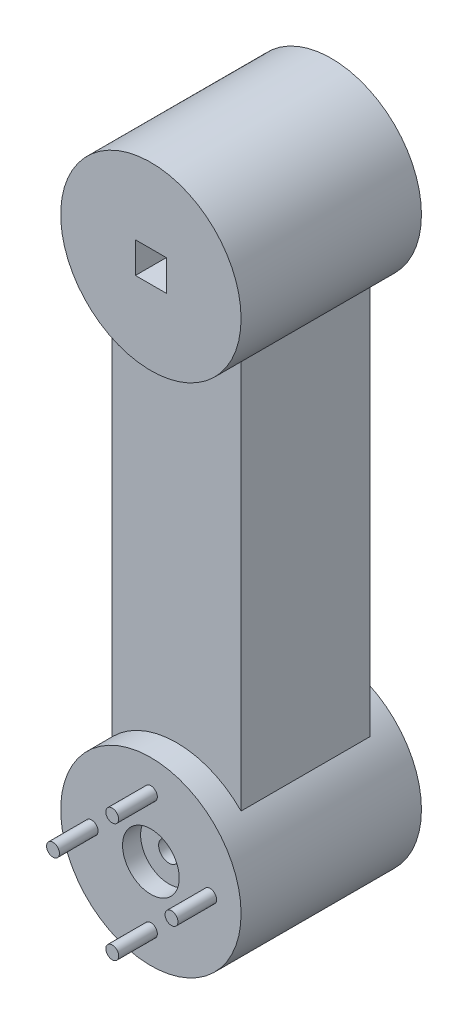
ISO-10303-21;
HEADER;
FILE_DESCRIPTION(('STEP AP214'),'2;1');
FILE_NAME('part.step','',(''),(''),'','','');
FILE_SCHEMA(('AUTOMOTIVE_DESIGN { 1 0 10303 214 1 1 1 1 }'));
ENDSEC;
DATA;
#1=APPLICATION_CONTEXT('core data for automotive mechanical design processes');
#2=APPLICATION_PROTOCOL_DEFINITION('international standard','automotive_design',2000,#1);
#3=PRODUCT_CONTEXT('',#1,'mechanical');
#4=PRODUCT('Part','Part','',(#3));
#5=PRODUCT_RELATED_PRODUCT_CATEGORY('part','',(#4));
#6=PRODUCT_DEFINITION_FORMATION('','',#4);
#7=PRODUCT_DEFINITION_CONTEXT('part definition',#1,'design');
#8=PRODUCT_DEFINITION('design','',#6,#7);
#9=PRODUCT_DEFINITION_SHAPE('','',#8);
#10=(LENGTH_UNIT() NAMED_UNIT(*) SI_UNIT(.MILLI.,.METRE.));
#11=(NAMED_UNIT(*) PLANE_ANGLE_UNIT() SI_UNIT($,.RADIAN.));
#12=(NAMED_UNIT(*) SI_UNIT($,.STERADIAN.) SOLID_ANGLE_UNIT());
#13=UNCERTAINTY_MEASURE_WITH_UNIT(LENGTH_MEASURE(1.E-05),#10,'distance_accuracy_value','');
#14=(GEOMETRIC_REPRESENTATION_CONTEXT(3) GLOBAL_UNCERTAINTY_ASSIGNED_CONTEXT((#13)) GLOBAL_UNIT_ASSIGNED_CONTEXT((#10,
#11,#12)) REPRESENTATION_CONTEXT('',''));
#15=CARTESIAN_POINT('',(0.,0.,0.));
#16=DIRECTION('',(0.,0.,1.));
#17=DIRECTION('',(1.,0.,0.));
#18=AXIS2_PLACEMENT_3D('',#15,#16,#17);
#19=CARTESIAN_POINT('',(0.,0.,150.));
#20=DIRECTION('',(0.,0.,-1.));
#21=DIRECTION('',(-1.,0.,0.));
#22=AXIS2_PLACEMENT_3D('',#19,#20,#21);
#23=CYLINDRICAL_SURFACE('',#22,4.);
#24=CARTESIAN_POINT('',(0.,0.,7.00000000000001));
#25=DIRECTION('',(0.,0.,1.));
#26=DIRECTION('',(1.,0.,0.));
#27=AXIS2_PLACEMENT_3D('',#24,#25,#26);
#28=CIRCLE('',#27,4.);
#29=CARTESIAN_POINT('',(4.,0.,7.00000000000001));
#30=VERTEX_POINT('',#29);
#31=EDGE_CURVE('E191',#30,#30,#28,.T.);
#32=ORIENTED_EDGE('',*,*,#31,.F.);
#33=EDGE_LOOP('',(#32));
#34=FACE_BOUND('',#33,.T.);
#35=CARTESIAN_POINT('',(0.,0.,63.));
#36=DIRECTION('',(0.,0.,1.));
#37=DIRECTION('',(1.,0.,0.));
#38=AXIS2_PLACEMENT_3D('',#35,#36,#37);
#39=CIRCLE('',#38,4.);
#40=CARTESIAN_POINT('',(4.,0.,63.));
#41=VERTEX_POINT('',#40);
#42=EDGE_CURVE('E183',#41,#41,#39,.T.);
#43=ORIENTED_EDGE('',*,*,#42,.T.);
#44=EDGE_LOOP('',(#43));
#45=FACE_BOUND('',#44,.T.);
#46=ADVANCED_FACE('F45',(#34,#45),#23,.F.);
#47=CARTESIAN_POINT('',(25.,200.,60.));
#48=DIRECTION('',(-1.,0.,0.));
#49=DIRECTION('',(0.,0.,1.));
#50=AXIS2_PLACEMENT_3D('',#47,#48,#49);
#51=PLANE('',#50);
#52=DIRECTION('',(0.,0.,-1.));
#53=VECTOR('',#52,1.);
#54=CARTESIAN_POINT('',(25.,175.505102572168,70.));
#55=LINE('',#54,#53);
#56=CARTESIAN_POINT('',(25.,175.505102572168,60.));
#57=VERTEX_POINT('',#56);
#58=CARTESIAN_POINT('',(25.,175.505102572168,10.));
#59=VERTEX_POINT('',#58);
#60=EDGE_CURVE('E208',#57,#59,#55,.T.);
#61=ORIENTED_EDGE('',*,*,#60,.F.);
#62=DIRECTION('',(0.,-1.,0.));
#63=VECTOR('',#62,1.);
#64=CARTESIAN_POINT('',(25.,200.,60.));
#65=LINE('',#64,#63);
#66=CARTESIAN_POINT('',(25.,24.494897427832,60.));
#67=VERTEX_POINT('',#66);
#68=EDGE_CURVE('E216',#57,#67,#65,.T.);
#69=ORIENTED_EDGE('',*,*,#68,.T.);
#70=DIRECTION('',(0.,0.,-1.));
#71=VECTOR('',#70,1.);
#72=CARTESIAN_POINT('',(25.,24.494897427832,70.));
#73=LINE('',#72,#71);
#74=CARTESIAN_POINT('',(25.,24.494897427832,10.));
#75=VERTEX_POINT('',#74);
#76=EDGE_CURVE('E248',#67,#75,#73,.T.);
#77=ORIENTED_EDGE('',*,*,#76,.T.);
#78=DIRECTION('',(0.,-1.,0.));
#79=VECTOR('',#78,1.);
#80=CARTESIAN_POINT('',(25.,200.,10.));
#81=LINE('',#80,#79);
#82=EDGE_CURVE('E225',#59,#75,#81,.T.);
#83=ORIENTED_EDGE('',*,*,#82,.F.);
#84=EDGE_LOOP('',(#61,#69,#77,#83));
#85=FACE_BOUND('',#84,.T.);
#86=ADVANCED_FACE('F290',(#85),#51,.F.);
#87=CARTESIAN_POINT('',(-25.,200.,60.));
#88=DIRECTION('',(1.,0.,0.));
#89=DIRECTION('',(0.,0.,-1.));
#90=AXIS2_PLACEMENT_3D('',#87,#88,#89);
#91=PLANE('',#90);
#92=DIRECTION('',(0.,0.,-1.));
#93=VECTOR('',#92,1.);
#94=CARTESIAN_POINT('',(-25.,175.505102572168,70.));
#95=LINE('',#94,#93);
#96=CARTESIAN_POINT('',(-25.,175.505102572168,10.));
#97=VERTEX_POINT('',#96);
#98=CARTESIAN_POINT('',(-25.,175.505102572168,60.));
#99=VERTEX_POINT('',#98);
#100=EDGE_CURVE('E200',#97,#99,#95,.F.);
#101=ORIENTED_EDGE('',*,*,#100,.F.);
#102=DIRECTION('',(0.,-1.,0.));
#103=VECTOR('',#102,1.);
#104=CARTESIAN_POINT('',(-25.,200.,10.));
#105=LINE('',#104,#103);
#106=CARTESIAN_POINT('',(-25.,24.494897427832,10.));
#107=VERTEX_POINT('',#106);
#108=EDGE_CURVE('E222',#97,#107,#105,.T.);
#109=ORIENTED_EDGE('',*,*,#108,.T.);
#110=DIRECTION('',(0.,0.,-1.));
#111=VECTOR('',#110,1.);
#112=CARTESIAN_POINT('',(-25.,24.494897427832,70.));
#113=LINE('',#112,#111);
#114=CARTESIAN_POINT('',(-25.,24.494897427832,60.));
#115=VERTEX_POINT('',#114);
#116=EDGE_CURVE('E240',#107,#115,#113,.F.);
#117=ORIENTED_EDGE('',*,*,#116,.T.);
#118=DIRECTION('',(0.,-1.,0.));
#119=VECTOR('',#118,1.);
#120=CARTESIAN_POINT('',(-25.,200.,60.));
#121=LINE('',#120,#119);
#122=EDGE_CURVE('E219',#99,#115,#121,.T.);
#123=ORIENTED_EDGE('',*,*,#122,.F.);
#124=EDGE_LOOP('',(#101,#109,#117,#123));
#125=FACE_BOUND('',#124,.T.);
#126=ADVANCED_FACE('F298',(#125),#91,.F.);
#127=CARTESIAN_POINT('',(0.,0.,70.));
#128=DIRECTION('',(0.,0.,-1.));
#129=DIRECTION('',(-1.,0.,0.));
#130=AXIS2_PLACEMENT_3D('',#127,#128,#129);
#131=CYLINDRICAL_SURFACE('',#130,35.0000000000001);
#132=CARTESIAN_POINT('',(0.,0.,0.));
#133=DIRECTION('',(0.,0.,1.));
#134=DIRECTION('',(1.,0.,0.));
#135=AXIS2_PLACEMENT_3D('',#132,#133,#134);
#136=CIRCLE('',#135,35.0000000000001);
#137=CARTESIAN_POINT('',(35.0000000000001,0.,0.));
#138=VERTEX_POINT('',#137);
#139=EDGE_CURVE('E228',#138,#138,#136,.T.);
#140=ORIENTED_EDGE('',*,*,#139,.T.);
#141=EDGE_LOOP('',(#140));
#142=FACE_BOUND('',#141,.T.);
#143=CARTESIAN_POINT('',(0.,0.,70.));
#144=DIRECTION('',(0.,0.,1.));
#145=DIRECTION('',(1.,0.,0.));
#146=AXIS2_PLACEMENT_3D('',#143,#144,#145);
#147=CIRCLE('',#146,35.0000000000001);
#148=CARTESIAN_POINT('',(35.0000000000001,0.,70.));
#149=VERTEX_POINT('',#148);
#150=EDGE_CURVE('E229',#149,#149,#147,.T.);
#151=ORIENTED_EDGE('',*,*,#150,.F.);
#152=EDGE_LOOP('',(#151));
#153=FACE_BOUND('',#152,.T.);
#154=ORIENTED_EDGE('',*,*,#76,.F.);
#155=CARTESIAN_POINT('',(0.,0.,60.));
#156=DIRECTION('',(0.,0.,-1.));
#157=DIRECTION('',(-1.,0.,0.));
#158=AXIS2_PLACEMENT_3D('',#155,#156,#157);
#159=CIRCLE('',#158,35.0000000000001);
#160=EDGE_CURVE('E233',#115,#67,#159,.T.);
#161=ORIENTED_EDGE('',*,*,#160,.F.);
#162=ORIENTED_EDGE('',*,*,#116,.F.);
#163=CARTESIAN_POINT('',(0.,0.,10.));
#164=DIRECTION('',(0.,0.,1.));
#165=DIRECTION('',(1.,0.,0.));
#166=AXIS2_PLACEMENT_3D('',#163,#164,#165);
#167=CIRCLE('',#166,35.0000000000001);
#168=EDGE_CURVE('E244',#75,#107,#167,.T.);
#169=ORIENTED_EDGE('',*,*,#168,.F.);
#170=EDGE_LOOP('',(#154,#161,#162,#169));
#171=FACE_BOUND('',#170,.T.);
#172=ADVANCED_FACE('F47',(#142,#153,#171),#131,.T.);
#173=CARTESIAN_POINT('',(0.,0.,70.));
#174=DIRECTION('',(0.,0.,1.));
#175=DIRECTION('',(1.,0.,0.));
#176=AXIS2_PLACEMENT_3D('',#173,#174,#175);
#177=PLANE('',#176);
#178=CARTESIAN_POINT('',(0.,23.0000000000001,70.));
#179=DIRECTION('',(0.,0.,1.));
#180=DIRECTION('',(1.,0.,0.));
#181=AXIS2_PLACEMENT_3D('',#178,#179,#180);
#182=CIRCLE('',#181,2.5);
#183=CARTESIAN_POINT('',(2.5,23.0000000000001,70.));
#184=VERTEX_POINT('',#183);
#185=EDGE_CURVE('E147',#184,#184,#182,.T.);
#186=ORIENTED_EDGE('',*,*,#185,.F.);
#187=EDGE_LOOP('',(#186));
#188=FACE_BOUND('',#187,.T.);
#189=CARTESIAN_POINT('',(23.0000000000001,0.,70.));
#190=DIRECTION('',(0.,0.,1.));
#191=DIRECTION('',(1.,0.,0.));
#192=AXIS2_PLACEMENT_3D('',#189,#190,#191);
#193=CIRCLE('',#192,2.5);
#194=CARTESIAN_POINT('',(25.5000000000001,0.,70.));
#195=VERTEX_POINT('',#194);
#196=EDGE_CURVE('E155',#195,#195,#193,.T.);
#197=ORIENTED_EDGE('',*,*,#196,.F.);
#198=EDGE_LOOP('',(#197));
#199=FACE_BOUND('',#198,.T.);
#200=CARTESIAN_POINT('',(0.,-23.0000000000001,70.));
#201=DIRECTION('',(0.,0.,1.));
#202=DIRECTION('',(1.,0.,0.));
#203=AXIS2_PLACEMENT_3D('',#200,#201,#202);
#204=CIRCLE('',#203,2.5);
#205=CARTESIAN_POINT('',(2.5,-23.0000000000001,70.));
#206=VERTEX_POINT('',#205);
#207=EDGE_CURVE('E163',#206,#206,#204,.T.);
#208=ORIENTED_EDGE('',*,*,#207,.F.);
#209=EDGE_LOOP('',(#208));
#210=FACE_BOUND('',#209,.T.);
#211=CARTESIAN_POINT('',(-23.0000000000001,0.,70.));
#212=DIRECTION('',(0.,0.,1.));
#213=DIRECTION('',(1.,0.,0.));
#214=AXIS2_PLACEMENT_3D('',#211,#212,#213);
#215=CIRCLE('',#214,2.5);
#216=CARTESIAN_POINT('',(-20.5000000000001,0.,70.));
#217=VERTEX_POINT('',#216);
#218=EDGE_CURVE('E167',#217,#217,#215,.T.);
#219=ORIENTED_EDGE('',*,*,#218,.F.);
#220=EDGE_LOOP('',(#219));
#221=FACE_BOUND('',#220,.T.);
#222=CARTESIAN_POINT('',(0.,0.,70.));
#223=DIRECTION('',(0.,0.,1.));
#224=DIRECTION('',(1.,0.,0.));
#225=AXIS2_PLACEMENT_3D('',#222,#223,#224);
#226=CIRCLE('',#225,11.);
#227=CARTESIAN_POINT('',(11.,0.,70.));
#228=VERTEX_POINT('',#227);
#229=EDGE_CURVE('E175',#228,#228,#226,.T.);
#230=ORIENTED_EDGE('',*,*,#229,.F.);
#231=EDGE_LOOP('',(#230));
#232=FACE_BOUND('',#231,.T.);
#233=ORIENTED_EDGE('',*,*,#150,.T.);
#234=EDGE_LOOP('',(#233));
#235=FACE_BOUND('',#234,.T.);
#236=ADVANCED_FACE('F326',(#188,#199,#210,#221,#232,#235),#177,.T.);
#237=CARTESIAN_POINT('',(0.,0.,0.));
#238=DIRECTION('',(0.,0.,1.));
#239=DIRECTION('',(1.,0.,0.));
#240=AXIS2_PLACEMENT_3D('',#237,#238,#239);
#241=PLANE('',#240);
#242=CARTESIAN_POINT('',(0.,0.,0.));
#243=DIRECTION('',(0.,0.,1.));
#244=DIRECTION('',(1.,0.,0.));
#245=AXIS2_PLACEMENT_3D('',#242,#243,#244);
#246=CIRCLE('',#245,11.);
#247=CARTESIAN_POINT('',(11.,0.,0.));
#248=VERTEX_POINT('',#247);
#249=EDGE_CURVE('E192',#248,#248,#246,.T.);
#250=ORIENTED_EDGE('',*,*,#249,.T.);
#251=EDGE_LOOP('',(#250));
#252=FACE_BOUND('',#251,.T.);
#253=ORIENTED_EDGE('',*,*,#139,.F.);
#254=EDGE_LOOP('',(#253));
#255=FACE_BOUND('',#254,.T.);
#256=ADVANCED_FACE('F323',(#252,#255),#241,.F.);
#257=CARTESIAN_POINT('',(-25.,200.,10.));
#258=DIRECTION('',(0.,0.,1.));
#259=DIRECTION('',(1.,0.,0.));
#260=AXIS2_PLACEMENT_3D('',#257,#258,#259);
#261=PLANE('',#260);
#262=CARTESIAN_POINT('',(0.,200.,10.));
#263=DIRECTION('',(0.,0.,1.));
#264=DIRECTION('',(1.,0.,0.));
#265=AXIS2_PLACEMENT_3D('',#262,#263,#264);
#266=CIRCLE('',#265,35.);
#267=EDGE_CURVE('E212',#59,#97,#266,.F.);
#268=ORIENTED_EDGE('',*,*,#267,.F.);
#269=ORIENTED_EDGE('',*,*,#82,.T.);
#270=ORIENTED_EDGE('',*,*,#168,.T.);
#271=ORIENTED_EDGE('',*,*,#108,.F.);
#272=EDGE_LOOP('',(#268,#269,#270,#271));
#273=FACE_BOUND('',#272,.T.);
#274=ADVANCED_FACE('F317',(#273),#261,.F.);
#275=CARTESIAN_POINT('',(-25.,200.,60.));
#276=DIRECTION('',(0.,0.,-1.));
#277=DIRECTION('',(-1.,0.,0.));
#278=AXIS2_PLACEMENT_3D('',#275,#276,#277);
#279=PLANE('',#278);
#280=CARTESIAN_POINT('',(0.,200.,60.));
#281=DIRECTION('',(0.,0.,-1.));
#282=DIRECTION('',(-1.,0.,0.));
#283=AXIS2_PLACEMENT_3D('',#280,#281,#282);
#284=CIRCLE('',#283,35.);
#285=EDGE_CURVE('E252',#99,#57,#284,.F.);
#286=ORIENTED_EDGE('',*,*,#285,.F.);
#287=ORIENTED_EDGE('',*,*,#122,.T.);
#288=ORIENTED_EDGE('',*,*,#160,.T.);
#289=ORIENTED_EDGE('',*,*,#68,.F.);
#290=EDGE_LOOP('',(#286,#287,#288,#289));
#291=FACE_BOUND('',#290,.T.);
#292=ADVANCED_FACE('F313',(#291),#279,.F.);
#293=CARTESIAN_POINT('',(0.,200.,70.));
#294=DIRECTION('',(0.,0.,-1.));
#295=DIRECTION('',(-1.,0.,0.));
#296=AXIS2_PLACEMENT_3D('',#293,#294,#295);
#297=CYLINDRICAL_SURFACE('',#296,35.);
#298=CARTESIAN_POINT('',(0.,200.,70.));
#299=DIRECTION('',(0.,0.,1.));
#300=DIRECTION('',(1.,0.,0.));
#301=AXIS2_PLACEMENT_3D('',#298,#299,#300);
#302=CIRCLE('',#301,35.);
#303=CARTESIAN_POINT('',(35.,200.,70.));
#304=VERTEX_POINT('',#303);
#305=EDGE_CURVE('E196',#304,#304,#302,.T.);
#306=ORIENTED_EDGE('',*,*,#305,.F.);
#307=EDGE_LOOP('',(#306));
#308=FACE_BOUND('',#307,.T.);
#309=CARTESIAN_POINT('',(0.,200.,0.));
#310=DIRECTION('',(0.,0.,1.));
#311=DIRECTION('',(1.,0.,0.));
#312=AXIS2_PLACEMENT_3D('',#309,#310,#311);
#313=CIRCLE('',#312,35.);
#314=CARTESIAN_POINT('',(35.,200.,0.));
#315=VERTEX_POINT('',#314);
#316=EDGE_CURVE('E201',#315,#315,#313,.T.);
#317=ORIENTED_EDGE('',*,*,#316,.T.);
#318=EDGE_LOOP('',(#317));
#319=FACE_BOUND('',#318,.T.);
#320=ORIENTED_EDGE('',*,*,#60,.T.);
#321=ORIENTED_EDGE('',*,*,#267,.T.);
#322=ORIENTED_EDGE('',*,*,#100,.T.);
#323=ORIENTED_EDGE('',*,*,#285,.T.);
#324=EDGE_LOOP('',(#320,#321,#322,#323));
#325=FACE_BOUND('',#324,.T.);
#326=ADVANCED_FACE('F309',(#308,#319,#325),#297,.T.);
#327=CARTESIAN_POINT('',(0.,200.,70.));
#328=DIRECTION('',(0.,0.,1.));
#329=DIRECTION('',(1.,0.,0.));
#330=AXIS2_PLACEMENT_3D('',#327,#328,#329);
#331=PLANE('',#330);
#332=DIRECTION('',(0.,1.,0.));
#333=VECTOR('',#332,1.);
#334=CARTESIAN_POINT('',(5.99999999999999,206.,70.));
#335=LINE('',#334,#333);
#336=CARTESIAN_POINT('',(5.99999999999999,194.,70.));
#337=VERTEX_POINT('',#336);
#338=CARTESIAN_POINT('',(5.99999999999999,206.,70.));
#339=VERTEX_POINT('',#338);
#340=EDGE_CURVE('E61',#337,#339,#335,.T.);
#341=ORIENTED_EDGE('',*,*,#340,.F.);
#342=DIRECTION('',(1.,0.,0.));
#343=VECTOR('',#342,1.);
#344=CARTESIAN_POINT('',(-6.00000000000001,194.,70.));
#345=LINE('',#344,#343);
#346=CARTESIAN_POINT('',(-6.00000000000001,194.,70.));
#347=VERTEX_POINT('',#346);
#348=EDGE_CURVE('E132',#347,#337,#345,.T.);
#349=ORIENTED_EDGE('',*,*,#348,.F.);
#350=DIRECTION('',(0.,-1.,0.));
#351=VECTOR('',#350,1.);
#352=CARTESIAN_POINT('',(-6.00000000000001,206.,70.));
#353=LINE('',#352,#351);
#354=CARTESIAN_POINT('',(-6.00000000000001,206.,70.));
#355=VERTEX_POINT('',#354);
#356=EDGE_CURVE('E114',#355,#347,#353,.T.);
#357=ORIENTED_EDGE('',*,*,#356,.F.);
#358=DIRECTION('',(-1.,0.,0.));
#359=VECTOR('',#358,1.);
#360=CARTESIAN_POINT('',(-6.00000000000001,206.,70.));
#361=LINE('',#360,#359);
#362=EDGE_CURVE('E124',#339,#355,#361,.T.);
#363=ORIENTED_EDGE('',*,*,#362,.F.);
#364=EDGE_LOOP('',(#341,#349,#357,#363));
#365=FACE_BOUND('',#364,.T.);
#366=ORIENTED_EDGE('',*,*,#305,.T.);
#367=EDGE_LOOP('',(#366));
#368=FACE_BOUND('',#367,.T.);
#369=ADVANCED_FACE('F129',(#365,#368),#331,.T.);
#370=CARTESIAN_POINT('',(0.,200.,0.));
#371=DIRECTION('',(0.,0.,1.));
#372=DIRECTION('',(1.,0.,0.));
#373=AXIS2_PLACEMENT_3D('',#370,#371,#372);
#374=PLANE('',#373);
#375=DIRECTION('',(1.,0.,0.));
#376=VECTOR('',#375,1.);
#377=CARTESIAN_POINT('',(0.,194.,0.));
#378=LINE('',#377,#376);
#379=CARTESIAN_POINT('',(-6.00000000000001,194.,0.));
#380=VERTEX_POINT('',#379);
#381=CARTESIAN_POINT('',(5.99999999999999,194.,0.));
#382=VERTEX_POINT('',#381);
#383=EDGE_CURVE('E54',#380,#382,#378,.T.);
#384=ORIENTED_EDGE('',*,*,#383,.T.);
#385=DIRECTION('',(0.,1.,0.));
#386=VECTOR('',#385,1.);
#387=CARTESIAN_POINT('',(5.99999999999999,200.,0.));
#388=LINE('',#387,#386);
#389=CARTESIAN_POINT('',(5.99999999999999,206.,0.));
#390=VERTEX_POINT('',#389);
#391=EDGE_CURVE('E11',#382,#390,#388,.T.);
#392=ORIENTED_EDGE('',*,*,#391,.T.);
#393=DIRECTION('',(-1.,0.,0.));
#394=VECTOR('',#393,1.);
#395=CARTESIAN_POINT('',(0.,206.,0.));
#396=LINE('',#395,#394);
#397=CARTESIAN_POINT('',(-6.00000000000001,206.,0.));
#398=VERTEX_POINT('',#397);
#399=EDGE_CURVE('E256',#390,#398,#396,.T.);
#400=ORIENTED_EDGE('',*,*,#399,.T.);
#401=DIRECTION('',(0.,-1.,0.));
#402=VECTOR('',#401,1.);
#403=CARTESIAN_POINT('',(-6.00000000000001,200.,0.));
#404=LINE('',#403,#402);
#405=EDGE_CURVE('E117',#398,#380,#404,.T.);
#406=ORIENTED_EDGE('',*,*,#405,.T.);
#407=EDGE_LOOP('',(#384,#392,#400,#406));
#408=FACE_BOUND('',#407,.T.);
#409=ORIENTED_EDGE('',*,*,#316,.F.);
#410=EDGE_LOOP('',(#409));
#411=FACE_BOUND('',#410,.T.);
#412=ADVANCED_FACE('F269',(#408,#411),#374,.F.);
#413=CARTESIAN_POINT('',(0.,0.,7.));
#414=DIRECTION('',(0.,0.,-1.));
#415=DIRECTION('',(-1.,0.,0.));
#416=AXIS2_PLACEMENT_3D('',#413,#414,#415);
#417=CYLINDRICAL_SURFACE('',#416,11.);
#418=CARTESIAN_POINT('',(0.,0.,7.));
#419=DIRECTION('',(0.,0.,1.));
#420=DIRECTION('',(1.,0.,0.));
#421=AXIS2_PLACEMENT_3D('',#418,#419,#420);
#422=CIRCLE('',#421,11.);
#423=CARTESIAN_POINT('',(11.,0.,7.));
#424=VERTEX_POINT('',#423);
#425=EDGE_CURVE('E187',#424,#424,#422,.T.);
#426=ORIENTED_EDGE('',*,*,#425,.T.);
#427=EDGE_LOOP('',(#426));
#428=FACE_BOUND('',#427,.T.);
#429=ORIENTED_EDGE('',*,*,#249,.F.);
#430=EDGE_LOOP('',(#429));
#431=FACE_BOUND('',#430,.T.);
#432=ADVANCED_FACE('F305',(#428,#431),#417,.F.);
#433=CARTESIAN_POINT('',(0.,0.,7.));
#434=DIRECTION('',(0.,0.,1.));
#435=DIRECTION('',(1.,0.,0.));
#436=AXIS2_PLACEMENT_3D('',#433,#434,#435);
#437=PLANE('',#436);
#438=ORIENTED_EDGE('',*,*,#31,.T.);
#439=EDGE_LOOP('',(#438));
#440=FACE_BOUND('',#439,.T.);
#441=ORIENTED_EDGE('',*,*,#425,.F.);
#442=EDGE_LOOP('',(#441));
#443=FACE_BOUND('',#442,.T.);
#444=ADVANCED_FACE('F400',(#440,#443),#437,.F.);
#445=CARTESIAN_POINT('',(0.,0.,63.));
#446=DIRECTION('',(0.,0.,1.));
#447=DIRECTION('',(1.,0.,0.));
#448=AXIS2_PLACEMENT_3D('',#445,#446,#447);
#449=CYLINDRICAL_SURFACE('',#448,11.);
#450=CARTESIAN_POINT('',(0.,0.,63.));
#451=DIRECTION('',(0.,0.,1.));
#452=DIRECTION('',(1.,0.,0.));
#453=AXIS2_PLACEMENT_3D('',#450,#451,#452);
#454=CIRCLE('',#453,11.);
#455=CARTESIAN_POINT('',(11.,0.,63.));
#456=VERTEX_POINT('',#455);
#457=EDGE_CURVE('E179',#456,#456,#454,.T.);
#458=ORIENTED_EDGE('',*,*,#457,.F.);
#459=EDGE_LOOP('',(#458));
#460=FACE_BOUND('',#459,.T.);
#461=ORIENTED_EDGE('',*,*,#229,.T.);
#462=EDGE_LOOP('',(#461));
#463=FACE_BOUND('',#462,.T.);
#464=ADVANCED_FACE('F408',(#460,#463),#449,.F.);
#465=CARTESIAN_POINT('',(0.,0.,63.));
#466=DIRECTION('',(0.,0.,1.));
#467=DIRECTION('',(1.,0.,0.));
#468=AXIS2_PLACEMENT_3D('',#465,#466,#467);
#469=PLANE('',#468);
#470=ORIENTED_EDGE('',*,*,#42,.F.);
#471=EDGE_LOOP('',(#470));
#472=FACE_BOUND('',#471,.T.);
#473=ORIENTED_EDGE('',*,*,#457,.T.);
#474=EDGE_LOOP('',(#473));
#475=FACE_BOUND('',#474,.T.);
#476=ADVANCED_FACE('F420',(#472,#475),#469,.T.);
#477=CARTESIAN_POINT('',(-23.0000000000001,0.,85.));
#478=DIRECTION('',(0.,0.,-1.));
#479=DIRECTION('',(-1.,0.,0.));
#480=AXIS2_PLACEMENT_3D('',#477,#478,#479);
#481=CYLINDRICAL_SURFACE('',#480,2.5);
#482=CARTESIAN_POINT('',(-23.0000000000001,0.,85.));
#483=DIRECTION('',(0.,0.,1.));
#484=DIRECTION('',(1.,0.,0.));
#485=AXIS2_PLACEMENT_3D('',#482,#483,#484);
#486=CIRCLE('',#485,2.5);
#487=CARTESIAN_POINT('',(-20.5000000000001,0.,85.));
#488=VERTEX_POINT('',#487);
#489=EDGE_CURVE('E171',#488,#488,#486,.T.);
#490=ORIENTED_EDGE('',*,*,#489,.F.);
#491=EDGE_LOOP('',(#490));
#492=FACE_BOUND('',#491,.T.);
#493=ORIENTED_EDGE('',*,*,#218,.T.);
#494=EDGE_LOOP('',(#493));
#495=FACE_BOUND('',#494,.T.);
#496=ADVANCED_FACE('F430',(#492,#495),#481,.T.);
#497=CARTESIAN_POINT('',(-23.0000000000001,0.,85.));
#498=DIRECTION('',(0.,0.,1.));
#499=DIRECTION('',(1.,0.,0.));
#500=AXIS2_PLACEMENT_3D('',#497,#498,#499);
#501=PLANE('',#500);
#502=ORIENTED_EDGE('',*,*,#489,.T.);
#503=EDGE_LOOP('',(#502));
#504=FACE_BOUND('',#503,.T.);
#505=ADVANCED_FACE('F440',(#504),#501,.T.);
#506=CARTESIAN_POINT('',(0.,-23.0000000000001,85.));
#507=DIRECTION('',(0.,0.,-1.));
#508=DIRECTION('',(-1.,0.,0.));
#509=AXIS2_PLACEMENT_3D('',#506,#507,#508);
#510=CYLINDRICAL_SURFACE('',#509,2.5);
#511=CARTESIAN_POINT('',(0.,-23.0000000000001,85.));
#512=DIRECTION('',(0.,0.,1.));
#513=DIRECTION('',(1.,0.,0.));
#514=AXIS2_PLACEMENT_3D('',#511,#512,#513);
#515=CIRCLE('',#514,2.5);
#516=CARTESIAN_POINT('',(2.5,-23.0000000000001,85.));
#517=VERTEX_POINT('',#516);
#518=EDGE_CURVE('E159',#517,#517,#515,.T.);
#519=ORIENTED_EDGE('',*,*,#518,.F.);
#520=EDGE_LOOP('',(#519));
#521=FACE_BOUND('',#520,.T.);
#522=ORIENTED_EDGE('',*,*,#207,.T.);
#523=EDGE_LOOP('',(#522));
#524=FACE_BOUND('',#523,.T.);
#525=ADVANCED_FACE('F450',(#521,#524),#510,.T.);
#526=CARTESIAN_POINT('',(0.,-23.0000000000001,85.));
#527=DIRECTION('',(0.,0.,1.));
#528=DIRECTION('',(1.,0.,0.));
#529=AXIS2_PLACEMENT_3D('',#526,#527,#528);
#530=PLANE('',#529);
#531=ORIENTED_EDGE('',*,*,#518,.T.);
#532=EDGE_LOOP('',(#531));
#533=FACE_BOUND('',#532,.T.);
#534=ADVANCED_FACE('F460',(#533),#530,.T.);
#535=CARTESIAN_POINT('',(23.0000000000001,0.,85.));
#536=DIRECTION('',(0.,0.,-1.));
#537=DIRECTION('',(-1.,0.,0.));
#538=AXIS2_PLACEMENT_3D('',#535,#536,#537);
#539=CYLINDRICAL_SURFACE('',#538,2.5);
#540=CARTESIAN_POINT('',(23.0000000000001,0.,85.));
#541=DIRECTION('',(0.,0.,1.));
#542=DIRECTION('',(1.,0.,0.));
#543=AXIS2_PLACEMENT_3D('',#540,#541,#542);
#544=CIRCLE('',#543,2.5);
#545=CARTESIAN_POINT('',(25.5000000000001,0.,85.));
#546=VERTEX_POINT('',#545);
#547=EDGE_CURVE('E151',#546,#546,#544,.T.);
#548=ORIENTED_EDGE('',*,*,#547,.F.);
#549=EDGE_LOOP('',(#548));
#550=FACE_BOUND('',#549,.T.);
#551=ORIENTED_EDGE('',*,*,#196,.T.);
#552=EDGE_LOOP('',(#551));
#553=FACE_BOUND('',#552,.T.);
#554=ADVANCED_FACE('F470',(#550,#553),#539,.T.);
#555=CARTESIAN_POINT('',(23.0000000000001,0.,85.));
#556=DIRECTION('',(0.,0.,1.));
#557=DIRECTION('',(1.,0.,0.));
#558=AXIS2_PLACEMENT_3D('',#555,#556,#557);
#559=PLANE('',#558);
#560=ORIENTED_EDGE('',*,*,#547,.T.);
#561=EDGE_LOOP('',(#560));
#562=FACE_BOUND('',#561,.T.);
#563=ADVANCED_FACE('F480',(#562),#559,.T.);
#564=CARTESIAN_POINT('',(0.,23.0000000000001,85.));
#565=DIRECTION('',(0.,0.,-1.));
#566=DIRECTION('',(-1.,0.,0.));
#567=AXIS2_PLACEMENT_3D('',#564,#565,#566);
#568=CYLINDRICAL_SURFACE('',#567,2.5);
#569=CARTESIAN_POINT('',(0.,23.0000000000001,85.));
#570=DIRECTION('',(0.,0.,1.));
#571=DIRECTION('',(1.,0.,0.));
#572=AXIS2_PLACEMENT_3D('',#569,#570,#571);
#573=CIRCLE('',#572,2.5);
#574=CARTESIAN_POINT('',(2.5,23.0000000000001,85.));
#575=VERTEX_POINT('',#574);
#576=EDGE_CURVE('E142',#575,#575,#573,.T.);
#577=ORIENTED_EDGE('',*,*,#576,.F.);
#578=EDGE_LOOP('',(#577));
#579=FACE_BOUND('',#578,.T.);
#580=ORIENTED_EDGE('',*,*,#185,.T.);
#581=EDGE_LOOP('',(#580));
#582=FACE_BOUND('',#581,.T.);
#583=ADVANCED_FACE('F284',(#579,#582),#568,.T.);
#584=CARTESIAN_POINT('',(0.,23.0000000000001,85.));
#585=DIRECTION('',(0.,0.,1.));
#586=DIRECTION('',(1.,0.,0.));
#587=AXIS2_PLACEMENT_3D('',#584,#585,#586);
#588=PLANE('',#587);
#589=ORIENTED_EDGE('',*,*,#576,.T.);
#590=EDGE_LOOP('',(#589));
#591=FACE_BOUND('',#590,.T.);
#592=ADVANCED_FACE('F276',(#591),#588,.T.);
#593=CARTESIAN_POINT('',(5.99999999999999,206.,-82.0000000000001));
#594=DIRECTION('',(1.,0.,0.));
#595=DIRECTION('',(0.,1.,0.));
#596=AXIS2_PLACEMENT_3D('',#593,#594,#595);
#597=PLANE('',#596);
#598=DIRECTION('',(0.,0.,1.));
#599=VECTOR('',#598,1.);
#600=CARTESIAN_POINT('',(5.99999999999999,194.,-82.0000000000001));
#601=LINE('',#600,#599);
#602=EDGE_CURVE('E139',#382,#337,#601,.T.);
#603=ORIENTED_EDGE('',*,*,#602,.T.);
#604=ORIENTED_EDGE('',*,*,#340,.T.);
#605=DIRECTION('',(0.,0.,1.));
#606=VECTOR('',#605,1.);
#607=CARTESIAN_POINT('',(5.99999999999999,206.,-82.0000000000001));
#608=LINE('',#607,#606);
#609=EDGE_CURVE('E121',#390,#339,#608,.T.);
#610=ORIENTED_EDGE('',*,*,#609,.F.);
#611=ORIENTED_EDGE('',*,*,#391,.F.);
#612=EDGE_LOOP('',(#603,#604,#610,#611));
#613=FACE_BOUND('',#612,.T.);
#614=ADVANCED_FACE('F274',(#613),#597,.F.);
#615=CARTESIAN_POINT('',(-6.00000000000001,194.,-82.0000000000001));
#616=DIRECTION('',(0.,-1.,0.));
#617=DIRECTION('',(0.,0.,-1.));
#618=AXIS2_PLACEMENT_3D('',#615,#616,#617);
#619=PLANE('',#618);
#620=DIRECTION('',(0.,0.,1.));
#621=VECTOR('',#620,1.);
#622=CARTESIAN_POINT('',(-6.00000000000001,194.,-82.0000000000001));
#623=LINE('',#622,#621);
#624=EDGE_CURVE('E120',#380,#347,#623,.T.);
#625=ORIENTED_EDGE('',*,*,#624,.T.);
#626=ORIENTED_EDGE('',*,*,#348,.T.);
#627=ORIENTED_EDGE('',*,*,#602,.F.);
#628=ORIENTED_EDGE('',*,*,#383,.F.);
#629=EDGE_LOOP('',(#625,#626,#627,#628));
#630=FACE_BOUND('',#629,.T.);
#631=ADVANCED_FACE('F273',(#630),#619,.F.);
#632=CARTESIAN_POINT('',(-6.00000000000001,206.,-82.0000000000001));
#633=DIRECTION('',(-1.,0.,0.));
#634=DIRECTION('',(0.,-1.,0.));
#635=AXIS2_PLACEMENT_3D('',#632,#633,#634);
#636=PLANE('',#635);
#637=DIRECTION('',(0.,0.,1.));
#638=VECTOR('',#637,1.);
#639=CARTESIAN_POINT('',(-6.00000000000001,206.,-82.0000000000001));
#640=LINE('',#639,#638);
#641=EDGE_CURVE('E69',#398,#355,#640,.T.);
#642=ORIENTED_EDGE('',*,*,#641,.T.);
#643=ORIENTED_EDGE('',*,*,#356,.T.);
#644=ORIENTED_EDGE('',*,*,#624,.F.);
#645=ORIENTED_EDGE('',*,*,#405,.F.);
#646=EDGE_LOOP('',(#642,#643,#644,#645));
#647=FACE_BOUND('',#646,.T.);
#648=ADVANCED_FACE('F111',(#647),#636,.F.);
#649=CARTESIAN_POINT('',(-6.00000000000001,206.,-82.0000000000001));
#650=DIRECTION('',(0.,1.,0.));
#651=DIRECTION('',(0.,0.,1.));
#652=AXIS2_PLACEMENT_3D('',#649,#650,#651);
#653=PLANE('',#652);
#654=ORIENTED_EDGE('',*,*,#609,.T.);
#655=ORIENTED_EDGE('',*,*,#362,.T.);
#656=ORIENTED_EDGE('',*,*,#641,.F.);
#657=ORIENTED_EDGE('',*,*,#399,.F.);
#658=EDGE_LOOP('',(#654,#655,#656,#657));
#659=FACE_BOUND('',#658,.T.);
#660=ADVANCED_FACE('F125',(#659),#653,.F.);
#661=CLOSED_SHELL('',(#46,#86,#126,#172,#236,#256,#274,#292,#326,#369,#412,#432,#444,#464,#476,
#496,#505,#525,#534,#554,#563,#583,#592,#614,#631,#648,#660));
#662=MANIFOLD_SOLID_BREP('B2',#661);
#663=ADVANCED_BREP_SHAPE_REPRESENTATION('',(#18,#662),#14);
#664=SHAPE_DEFINITION_REPRESENTATION(#9,#663);
ENDSEC;
END-ISO-10303-21;
